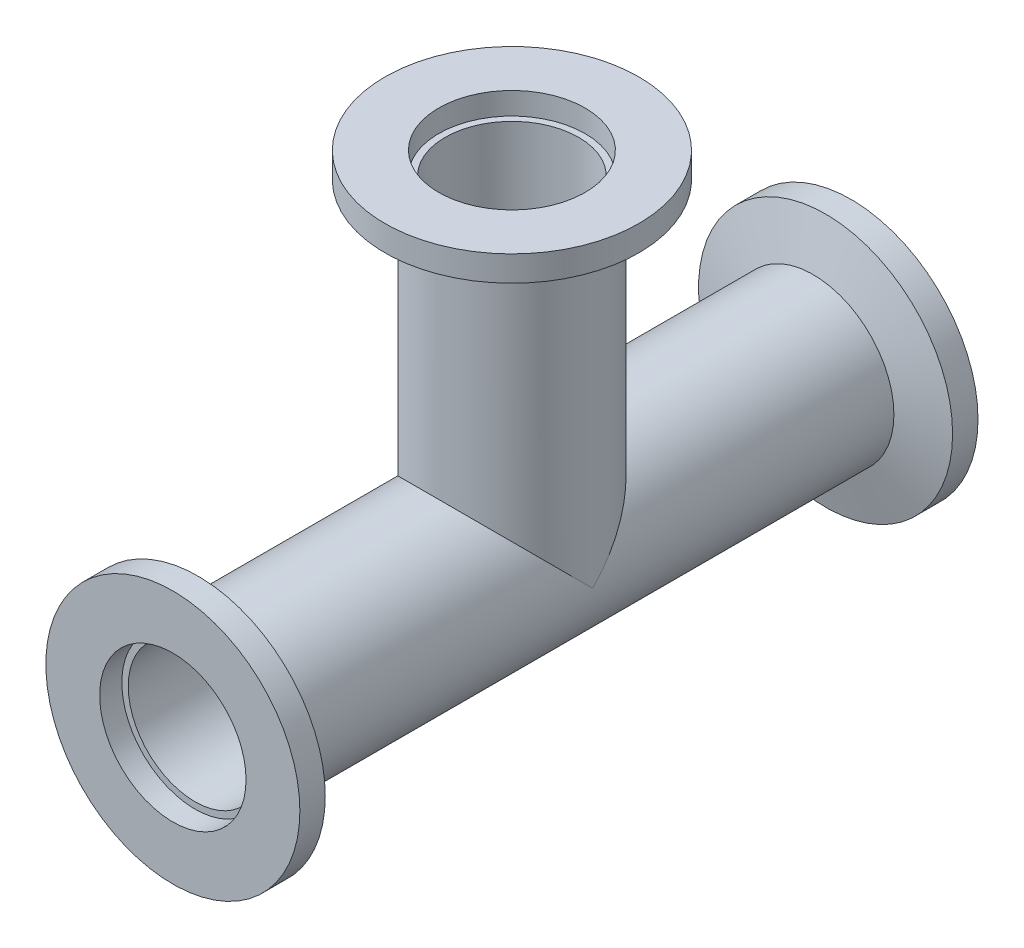
ISO-10303-21;
HEADER;
FILE_DESCRIPTION(('STEP AP214'),'2;1');
FILE_NAME('part.step','',(''),(''),'','','');
FILE_SCHEMA(('AUTOMOTIVE_DESIGN { 1 0 10303 214 1 1 1 1 }'));
ENDSEC;
DATA;
#1=APPLICATION_CONTEXT('core data for automotive mechanical design processes');
#2=APPLICATION_PROTOCOL_DEFINITION('international standard','automotive_design',2000,#1);
#3=PRODUCT_CONTEXT('',#1,'mechanical');
#4=PRODUCT('Part','Part','',(#3));
#5=PRODUCT_RELATED_PRODUCT_CATEGORY('part','',(#4));
#6=PRODUCT_DEFINITION_FORMATION('','',#4);
#7=PRODUCT_DEFINITION_CONTEXT('part definition',#1,'design');
#8=PRODUCT_DEFINITION('design','',#6,#7);
#9=PRODUCT_DEFINITION_SHAPE('','',#8);
#10=(LENGTH_UNIT() NAMED_UNIT(*) SI_UNIT(.MILLI.,.METRE.));
#11=(NAMED_UNIT(*) PLANE_ANGLE_UNIT() SI_UNIT($,.RADIAN.));
#12=(NAMED_UNIT(*) SI_UNIT($,.STERADIAN.) SOLID_ANGLE_UNIT());
#13=UNCERTAINTY_MEASURE_WITH_UNIT(LENGTH_MEASURE(1.E-05),#10,'distance_accuracy_value','');
#14=(GEOMETRIC_REPRESENTATION_CONTEXT(3) GLOBAL_UNCERTAINTY_ASSIGNED_CONTEXT((#13)) GLOBAL_UNIT_ASSIGNED_CONTEXT((#10,
#11,#12)) REPRESENTATION_CONTEXT('',''));
#15=CARTESIAN_POINT('',(0.,0.,0.));
#16=DIRECTION('',(0.,0.,1.));
#17=DIRECTION('',(1.,0.,0.));
#18=AXIS2_PLACEMENT_3D('',#15,#16,#17);
#19=CARTESIAN_POINT('',(0.,-12.5095,-40.005));
#20=DIRECTION('',(0.,0.,1.));
#21=DIRECTION('',(1.,0.,0.));
#22=AXIS2_PLACEMENT_3D('',#19,#20,#21);
#23=CYLINDRICAL_SURFACE('',#22,7.874);
#24=CARTESIAN_POINT('',(0.,-12.5095,-37.3888));
#25=DIRECTION('',(0.,0.,1.));
#26=DIRECTION('',(1.,0.,0.));
#27=AXIS2_PLACEMENT_3D('',#24,#25,#26);
#28=CIRCLE('',#27,7.874);
#29=CARTESIAN_POINT('',(7.874,-12.5095,-37.3888));
#30=VERTEX_POINT('',#29);
#31=EDGE_CURVE('E161',#30,#30,#28,.T.);
#32=ORIENTED_EDGE('',*,*,#31,.F.);
#33=EDGE_LOOP('',(#32));
#34=FACE_BOUND('',#33,.T.);
#35=CARTESIAN_POINT('',(0.,-12.5095,37.3888));
#36=DIRECTION('',(0.,0.,-1.));
#37=DIRECTION('',(-1.,0.,0.));
#38=AXIS2_PLACEMENT_3D('',#35,#36,#37);
#39=CIRCLE('',#38,7.874);
#40=CARTESIAN_POINT('',(-7.874,-12.5095,37.3888));
#41=VERTEX_POINT('',#40);
#42=EDGE_CURVE('E159',#41,#41,#39,.T.);
#43=ORIENTED_EDGE('',*,*,#42,.F.);
#44=EDGE_LOOP('',(#43));
#45=FACE_BOUND('',#44,.T.);
#46=CARTESIAN_POINT('',(0.,-12.5095,0.));
#47=DIRECTION('',(0.,-0.707106781186547,0.707106781186547));
#48=DIRECTION('',(0.,0.707106781186547,0.707106781186547));
#49=AXIS2_PLACEMENT_3D('',#46,#47,#48);
#50=ELLIPSE('',#49,11.1355175901257,7.874);
#51=CARTESIAN_POINT('',(7.874,-12.5095,0.));
#52=VERTEX_POINT('',#51);
#53=CARTESIAN_POINT('',(-7.874,-12.5095,0.));
#54=VERTEX_POINT('',#53);
#55=EDGE_CURVE('E11',#52,#54,#50,.T.);
#56=ORIENTED_EDGE('',*,*,#55,.F.);
#57=CARTESIAN_POINT('',(0.,-12.5095,0.));
#58=DIRECTION('',(0.,0.707106781186547,0.707106781186547));
#59=DIRECTION('',(0.,-0.707106781186547,0.707106781186547));
#60=AXIS2_PLACEMENT_3D('',#57,#58,#59);
#61=ELLIPSE('',#60,11.1355175901257,7.874);
#62=EDGE_CURVE('E47',#54,#52,#61,.F.);
#63=ORIENTED_EDGE('',*,*,#62,.F.);
#64=EDGE_LOOP('',(#56,#63));
#65=FACE_BOUND('',#64,.T.);
#66=ADVANCED_FACE('F39',(#34,#45,#65),#23,.F.);
#67=CARTESIAN_POINT('',(0.,-12.5095,40.005));
#68=DIRECTION('',(0.,0.,1.));
#69=DIRECTION('',(1.,0.,0.));
#70=AXIS2_PLACEMENT_3D('',#67,#68,#69);
#71=CYLINDRICAL_SURFACE('',#70,9.525);
#72=CARTESIAN_POINT('',(0.,-12.5095,-35.5445294601337));
#73=DIRECTION('',(0.,0.,1.));
#74=DIRECTION('',(1.,0.,0.));
#75=AXIS2_PLACEMENT_3D('',#72,#73,#74);
#76=CIRCLE('',#75,9.525);
#77=CARTESIAN_POINT('',(9.525,-12.5095,-35.5445294601337));
#78=VERTEX_POINT('',#77);
#79=EDGE_CURVE('E153',#78,#78,#76,.T.);
#80=ORIENTED_EDGE('',*,*,#79,.T.);
#81=EDGE_LOOP('',(#80));
#82=FACE_BOUND('',#81,.T.);
#83=CARTESIAN_POINT('',(0.,-12.5095,35.5445294601336));
#84=DIRECTION('',(0.,0.,1.));
#85=DIRECTION('',(1.,0.,0.));
#86=AXIS2_PLACEMENT_3D('',#83,#84,#85);
#87=CIRCLE('',#86,9.525);
#88=CARTESIAN_POINT('',(9.525,-12.5095,35.5445294601336));
#89=VERTEX_POINT('',#88);
#90=EDGE_CURVE('E149',#89,#89,#87,.T.);
#91=ORIENTED_EDGE('',*,*,#90,.F.);
#92=EDGE_LOOP('',(#91));
#93=FACE_BOUND('',#92,.T.);
#94=CARTESIAN_POINT('',(0.,-12.5095,0.));
#95=DIRECTION('',(0.,-0.707106781186547,0.707106781186547));
#96=DIRECTION('',(0.,0.707106781186547,0.707106781186547));
#97=AXIS2_PLACEMENT_3D('',#94,#95,#96);
#98=ELLIPSE('',#97,13.4703841816037,9.525);
#99=CARTESIAN_POINT('',(-9.525,-12.5095,0.));
#100=VERTEX_POINT('',#99);
#101=CARTESIAN_POINT('',(9.525,-12.5095,0.));
#102=VERTEX_POINT('',#101);
#103=EDGE_CURVE('E66',#100,#102,#98,.F.);
#104=ORIENTED_EDGE('',*,*,#103,.F.);
#105=CARTESIAN_POINT('',(0.,-12.5095,0.));
#106=DIRECTION('',(0.,0.707106781186547,0.707106781186547));
#107=DIRECTION('',(0.,-0.707106781186547,0.707106781186547));
#108=AXIS2_PLACEMENT_3D('',#105,#106,#107);
#109=ELLIPSE('',#108,13.4703841816037,9.525);
#110=EDGE_CURVE('E58',#102,#100,#109,.T.);
#111=ORIENTED_EDGE('',*,*,#110,.F.);
#112=EDGE_LOOP('',(#104,#111));
#113=FACE_BOUND('',#112,.T.);
#114=ADVANCED_FACE('F68',(#82,#93,#113),#71,.T.);
#115=CARTESIAN_POINT('',(0.,-3.87350000000002,40.005));
#116=DIRECTION('',(0.,0.,-1.));
#117=DIRECTION('',(-1.,0.,0.));
#118=AXIS2_PLACEMENT_3D('',#115,#116,#117);
#119=PLANE('',#118);
#120=CARTESIAN_POINT('',(0.,-12.5095,40.005));
#121=DIRECTION('',(0.,0.,1.));
#122=DIRECTION('',(1.,0.,0.));
#123=AXIS2_PLACEMENT_3D('',#120,#121,#122);
#124=CIRCLE('',#123,8.63599999999998);
#125=CARTESIAN_POINT('',(8.63599999999998,-12.5095,40.005));
#126=VERTEX_POINT('',#125);
#127=EDGE_CURVE('E185',#126,#126,#124,.T.);
#128=ORIENTED_EDGE('',*,*,#127,.F.);
#129=EDGE_LOOP('',(#128));
#130=FACE_BOUND('',#129,.T.);
#131=CARTESIAN_POINT('',(0.,-12.5095,40.005));
#132=DIRECTION('',(0.,0.,1.));
#133=DIRECTION('',(1.,0.,0.));
#134=AXIS2_PLACEMENT_3D('',#131,#132,#133);
#135=CIRCLE('',#134,14.986);
#136=CARTESIAN_POINT('',(14.986,-12.5095,40.005));
#137=VERTEX_POINT('',#136);
#138=EDGE_CURVE('E145',#137,#137,#135,.T.);
#139=ORIENTED_EDGE('',*,*,#138,.T.);
#140=EDGE_LOOP('',(#139));
#141=FACE_BOUND('',#140,.T.);
#142=ADVANCED_FACE('F41',(#130,#141),#119,.F.);
#143=CARTESIAN_POINT('',(0.,-12.5095,40.005));
#144=DIRECTION('',(0.,0.,1.));
#145=DIRECTION('',(1.,0.,0.));
#146=AXIS2_PLACEMENT_3D('',#143,#144,#145);
#147=CYLINDRICAL_SURFACE('',#146,14.986);
#148=ORIENTED_EDGE('',*,*,#138,.F.);
#149=EDGE_LOOP('',(#148));
#150=FACE_BOUND('',#149,.T.);
#151=CARTESIAN_POINT('',(0.,-12.5095,37.0078));
#152=DIRECTION('',(0.,0.,1.));
#153=DIRECTION('',(1.,0.,0.));
#154=AXIS2_PLACEMENT_3D('',#151,#152,#153);
#155=CIRCLE('',#154,14.986);
#156=CARTESIAN_POINT('',(14.986,-12.5095,37.0078));
#157=VERTEX_POINT('',#156);
#158=EDGE_CURVE('E148',#157,#157,#155,.T.);
#159=ORIENTED_EDGE('',*,*,#158,.T.);
#160=EDGE_LOOP('',(#159));
#161=FACE_BOUND('',#160,.T.);
#162=ADVANCED_FACE('F134',(#150,#161),#147,.T.);
#163=CARTESIAN_POINT('',(0.,-12.5095,35.5445294601336));
#164=DIRECTION('',(0.,0.,1.));
#165=DIRECTION('',(1.,0.,0.));
#166=AXIS2_PLACEMENT_3D('',#163,#164,#165);
#167=CONICAL_SURFACE('',#166,9.525,1.30899693899575);
#168=ORIENTED_EDGE('',*,*,#158,.F.);
#169=EDGE_LOOP('',(#168));
#170=FACE_BOUND('',#169,.T.);
#171=ORIENTED_EDGE('',*,*,#90,.T.);
#172=EDGE_LOOP('',(#171));
#173=FACE_BOUND('',#172,.T.);
#174=ADVANCED_FACE('F130',(#170,#173),#167,.T.);
#175=CARTESIAN_POINT('',(0.,-12.5095,-37.0078));
#176=DIRECTION('',(0.,0.,-1.));
#177=DIRECTION('',(-1.,0.,0.));
#178=AXIS2_PLACEMENT_3D('',#175,#176,#177);
#179=CONICAL_SURFACE('',#178,14.986,1.30899693899575);
#180=ORIENTED_EDGE('',*,*,#79,.F.);
#181=EDGE_LOOP('',(#180));
#182=FACE_BOUND('',#181,.T.);
#183=CARTESIAN_POINT('',(0.,-12.5095,-37.0078));
#184=DIRECTION('',(0.,0.,1.));
#185=DIRECTION('',(1.,0.,0.));
#186=AXIS2_PLACEMENT_3D('',#183,#184,#185);
#187=CIRCLE('',#186,14.986);
#188=CARTESIAN_POINT('',(14.986,-12.5095,-37.0078));
#189=VERTEX_POINT('',#188);
#190=EDGE_CURVE('E200',#189,#189,#187,.T.);
#191=ORIENTED_EDGE('',*,*,#190,.T.);
#192=EDGE_LOOP('',(#191));
#193=FACE_BOUND('',#192,.T.);
#194=ADVANCED_FACE('F127',(#182,#193),#179,.T.);
#195=CARTESIAN_POINT('',(0.,-12.5095,40.005));
#196=DIRECTION('',(0.,0.,1.));
#197=DIRECTION('',(1.,0.,0.));
#198=AXIS2_PLACEMENT_3D('',#195,#196,#197);
#199=CYLINDRICAL_SURFACE('',#198,14.986);
#200=ORIENTED_EDGE('',*,*,#190,.F.);
#201=EDGE_LOOP('',(#200));
#202=FACE_BOUND('',#201,.T.);
#203=CARTESIAN_POINT('',(0.,-12.5095,-40.005));
#204=DIRECTION('',(0.,0.,1.));
#205=DIRECTION('',(1.,0.,0.));
#206=AXIS2_PLACEMENT_3D('',#203,#204,#205);
#207=CIRCLE('',#206,14.986);
#208=CARTESIAN_POINT('',(14.986,-12.5095,-40.005));
#209=VERTEX_POINT('',#208);
#210=EDGE_CURVE('E197',#209,#209,#207,.T.);
#211=ORIENTED_EDGE('',*,*,#210,.T.);
#212=EDGE_LOOP('',(#211));
#213=FACE_BOUND('',#212,.T.);
#214=ADVANCED_FACE('F123',(#202,#213),#199,.T.);
#215=CARTESIAN_POINT('',(0.,2.4765,-40.005));
#216=DIRECTION('',(0.,0.,1.));
#217=DIRECTION('',(1.,0.,0.));
#218=AXIS2_PLACEMENT_3D('',#215,#216,#217);
#219=PLANE('',#218);
#220=ORIENTED_EDGE('',*,*,#210,.F.);
#221=EDGE_LOOP('',(#220));
#222=FACE_BOUND('',#221,.T.);
#223=CARTESIAN_POINT('',(0.,-12.5095,-40.005));
#224=DIRECTION('',(0.,0.,1.));
#225=DIRECTION('',(1.,0.,0.));
#226=AXIS2_PLACEMENT_3D('',#223,#224,#225);
#227=CIRCLE('',#226,8.636);
#228=CARTESIAN_POINT('',(8.636,-12.5095,-40.005));
#229=VERTEX_POINT('',#228);
#230=EDGE_CURVE('E194',#229,#229,#227,.T.);
#231=ORIENTED_EDGE('',*,*,#230,.T.);
#232=EDGE_LOOP('',(#231));
#233=FACE_BOUND('',#232,.T.);
#234=ADVANCED_FACE('F119',(#222,#233),#219,.F.);
#235=CARTESIAN_POINT('',(0.,-12.5095,40.005));
#236=DIRECTION('',(0.,0.,1.));
#237=DIRECTION('',(1.,0.,0.));
#238=AXIS2_PLACEMENT_3D('',#235,#236,#237);
#239=CYLINDRICAL_SURFACE('',#238,8.636);
#240=ORIENTED_EDGE('',*,*,#230,.F.);
#241=EDGE_LOOP('',(#240));
#242=FACE_BOUND('',#241,.T.);
#243=CARTESIAN_POINT('',(0.,-12.5095,-37.3888));
#244=DIRECTION('',(0.,0.,1.));
#245=DIRECTION('',(1.,0.,0.));
#246=AXIS2_PLACEMENT_3D('',#243,#244,#245);
#247=CIRCLE('',#246,8.636);
#248=CARTESIAN_POINT('',(8.636,-12.5095,-37.3888));
#249=VERTEX_POINT('',#248);
#250=EDGE_CURVE('E191',#249,#249,#247,.T.);
#251=ORIENTED_EDGE('',*,*,#250,.T.);
#252=EDGE_LOOP('',(#251));
#253=FACE_BOUND('',#252,.T.);
#254=ADVANCED_FACE('F115',(#242,#253),#239,.F.);
#255=CARTESIAN_POINT('',(0.,-3.8735,-37.3888));
#256=DIRECTION('',(0.,0.,1.));
#257=DIRECTION('',(1.,0.,0.));
#258=AXIS2_PLACEMENT_3D('',#255,#256,#257);
#259=PLANE('',#258);
#260=ORIENTED_EDGE('',*,*,#31,.T.);
#261=EDGE_LOOP('',(#260));
#262=FACE_BOUND('',#261,.T.);
#263=ORIENTED_EDGE('',*,*,#250,.F.);
#264=EDGE_LOOP('',(#263));
#265=FACE_BOUND('',#264,.T.);
#266=ADVANCED_FACE('F111',(#262,#265),#259,.F.);
#267=CARTESIAN_POINT('',(0.,-3.87350000000002,37.3888));
#268=DIRECTION('',(0.,0.,-1.));
#269=DIRECTION('',(-1.,0.,0.));
#270=AXIS2_PLACEMENT_3D('',#267,#268,#269);
#271=PLANE('',#270);
#272=ORIENTED_EDGE('',*,*,#42,.T.);
#273=EDGE_LOOP('',(#272));
#274=FACE_BOUND('',#273,.T.);
#275=CARTESIAN_POINT('',(0.,-12.5095,37.3888));
#276=DIRECTION('',(0.,0.,1.));
#277=DIRECTION('',(1.,0.,0.));
#278=AXIS2_PLACEMENT_3D('',#275,#276,#277);
#279=CIRCLE('',#278,8.63599999999998);
#280=CARTESIAN_POINT('',(8.63599999999998,-12.5095,37.3888));
#281=VERTEX_POINT('',#280);
#282=EDGE_CURVE('E188',#281,#281,#279,.T.);
#283=ORIENTED_EDGE('',*,*,#282,.T.);
#284=EDGE_LOOP('',(#283));
#285=FACE_BOUND('',#284,.T.);
#286=ADVANCED_FACE('F108',(#274,#285),#271,.F.);
#287=CARTESIAN_POINT('',(0.,-12.5095,40.005));
#288=DIRECTION('',(0.,0.,1.));
#289=DIRECTION('',(1.,0.,0.));
#290=AXIS2_PLACEMENT_3D('',#287,#288,#289);
#291=CYLINDRICAL_SURFACE('',#290,8.63599999999998);
#292=ORIENTED_EDGE('',*,*,#282,.F.);
#293=EDGE_LOOP('',(#292));
#294=FACE_BOUND('',#293,.T.);
#295=ORIENTED_EDGE('',*,*,#127,.T.);
#296=EDGE_LOOP('',(#295));
#297=FACE_BOUND('',#296,.T.);
#298=ADVANCED_FACE('F95',(#294,#297),#291,.F.);
#299=CARTESIAN_POINT('',(0.,-12.5095,0.));
#300=DIRECTION('',(0.,-1.,0.));
#301=DIRECTION('',(0.,0.,-1.));
#302=AXIS2_PLACEMENT_3D('',#299,#300,#301);
#303=CYLINDRICAL_SURFACE('',#302,9.525);
#304=CARTESIAN_POINT('',(0.,23.0350294601337,0.));
#305=DIRECTION('',(0.,-1.,0.));
#306=DIRECTION('',(0.,0.,-1.));
#307=AXIS2_PLACEMENT_3D('',#304,#305,#306);
#308=CIRCLE('',#307,9.52500000000001);
#309=CARTESIAN_POINT('',(0.,23.0350294601337,-9.52500000000001));
#310=VERTEX_POINT('',#309);
#311=EDGE_CURVE('E176',#310,#310,#308,.T.);
#312=ORIENTED_EDGE('',*,*,#311,.T.);
#313=EDGE_LOOP('',(#312));
#314=FACE_BOUND('',#313,.T.);
#315=ORIENTED_EDGE('',*,*,#110,.T.);
#316=ORIENTED_EDGE('',*,*,#103,.T.);
#317=EDGE_LOOP('',(#315,#316));
#318=FACE_BOUND('',#317,.T.);
#319=ADVANCED_FACE('F91',(#314,#318),#303,.T.);
#320=CARTESIAN_POINT('',(0.,27.4955,14.986));
#321=DIRECTION('',(0.,-1.,0.));
#322=DIRECTION('',(0.,0.,-1.));
#323=AXIS2_PLACEMENT_3D('',#320,#321,#322);
#324=PLANE('',#323);
#325=CARTESIAN_POINT('',(0.,27.4955,0.));
#326=DIRECTION('',(0.,-1.,0.));
#327=DIRECTION('',(0.,0.,-1.));
#328=AXIS2_PLACEMENT_3D('',#325,#326,#327);
#329=CIRCLE('',#328,14.986);
#330=CARTESIAN_POINT('',(0.,27.4955,-14.986));
#331=VERTEX_POINT('',#330);
#332=EDGE_CURVE('E165',#331,#331,#329,.T.);
#333=ORIENTED_EDGE('',*,*,#332,.F.);
#334=EDGE_LOOP('',(#333));
#335=FACE_BOUND('',#334,.T.);
#336=CARTESIAN_POINT('',(0.,27.4955,0.));
#337=DIRECTION('',(0.,-1.,0.));
#338=DIRECTION('',(0.,0.,-1.));
#339=AXIS2_PLACEMENT_3D('',#336,#337,#338);
#340=CIRCLE('',#339,8.63600000000002);
#341=CARTESIAN_POINT('',(0.,27.4955,-8.63600000000002));
#342=VERTEX_POINT('',#341);
#343=EDGE_CURVE('E182',#342,#342,#340,.T.);
#344=ORIENTED_EDGE('',*,*,#343,.T.);
#345=EDGE_LOOP('',(#344));
#346=FACE_BOUND('',#345,.T.);
#347=ADVANCED_FACE('F94',(#335,#346),#324,.F.);
#348=CARTESIAN_POINT('',(0.,-12.5095,0.));
#349=DIRECTION('',(0.,-1.,0.));
#350=DIRECTION('',(0.,0.,-1.));
#351=AXIS2_PLACEMENT_3D('',#348,#349,#350);
#352=CYLINDRICAL_SURFACE('',#351,8.63600000000002);
#353=ORIENTED_EDGE('',*,*,#343,.F.);
#354=EDGE_LOOP('',(#353));
#355=FACE_BOUND('',#354,.T.);
#356=CARTESIAN_POINT('',(0.,24.8793,0.));
#357=DIRECTION('',(0.,-1.,0.));
#358=DIRECTION('',(0.,0.,-1.));
#359=AXIS2_PLACEMENT_3D('',#356,#357,#358);
#360=CIRCLE('',#359,8.63600000000002);
#361=CARTESIAN_POINT('',(0.,24.8793,-8.63600000000002));
#362=VERTEX_POINT('',#361);
#363=EDGE_CURVE('E179',#362,#362,#360,.T.);
#364=ORIENTED_EDGE('',*,*,#363,.T.);
#365=EDGE_LOOP('',(#364));
#366=FACE_BOUND('',#365,.T.);
#367=ADVANCED_FACE('F98',(#355,#366),#352,.F.);
#368=CARTESIAN_POINT('',(0.,24.8793,8.63600000000002));
#369=DIRECTION('',(0.,-1.,0.));
#370=DIRECTION('',(0.,0.,-1.));
#371=AXIS2_PLACEMENT_3D('',#368,#369,#370);
#372=PLANE('',#371);
#373=CARTESIAN_POINT('',(0.,24.8793,0.));
#374=DIRECTION('',(0.,-1.,0.));
#375=DIRECTION('',(0.,0.,-1.));
#376=AXIS2_PLACEMENT_3D('',#373,#374,#375);
#377=CIRCLE('',#376,7.874);
#378=CARTESIAN_POINT('',(0.,24.8793,-7.87400000000002));
#379=VERTEX_POINT('',#378);
#380=EDGE_CURVE('E162',#379,#379,#377,.F.);
#381=ORIENTED_EDGE('',*,*,#380,.F.);
#382=EDGE_LOOP('',(#381));
#383=FACE_BOUND('',#382,.T.);
#384=ORIENTED_EDGE('',*,*,#363,.F.);
#385=EDGE_LOOP('',(#384));
#386=FACE_BOUND('',#385,.T.);
#387=ADVANCED_FACE('F89',(#383,#386),#372,.F.);
#388=CARTESIAN_POINT('',(0.,24.4983,0.));
#389=DIRECTION('',(0.,1.,0.));
#390=DIRECTION('',(0.,0.,1.));
#391=AXIS2_PLACEMENT_3D('',#388,#389,#390);
#392=CONICAL_SURFACE('',#391,14.986,1.30899693899575);
#393=ORIENTED_EDGE('',*,*,#311,.F.);
#394=EDGE_LOOP('',(#393));
#395=FACE_BOUND('',#394,.T.);
#396=CARTESIAN_POINT('',(0.,24.4983,0.));
#397=DIRECTION('',(0.,-1.,0.));
#398=DIRECTION('',(0.,0.,-1.));
#399=AXIS2_PLACEMENT_3D('',#396,#397,#398);
#400=CIRCLE('',#399,14.986);
#401=CARTESIAN_POINT('',(0.,24.4983,-14.986));
#402=VERTEX_POINT('',#401);
#403=EDGE_CURVE('E173',#402,#402,#400,.T.);
#404=ORIENTED_EDGE('',*,*,#403,.T.);
#405=EDGE_LOOP('',(#404));
#406=FACE_BOUND('',#405,.T.);
#407=ADVANCED_FACE('F85',(#395,#406),#392,.T.);
#408=CARTESIAN_POINT('',(0.,-12.5095,0.));
#409=DIRECTION('',(0.,-1.,0.));
#410=DIRECTION('',(0.,0.,-1.));
#411=AXIS2_PLACEMENT_3D('',#408,#409,#410);
#412=CYLINDRICAL_SURFACE('',#411,14.986);
#413=ORIENTED_EDGE('',*,*,#403,.F.);
#414=EDGE_LOOP('',(#413));
#415=FACE_BOUND('',#414,.T.);
#416=ORIENTED_EDGE('',*,*,#332,.T.);
#417=EDGE_LOOP('',(#416));
#418=FACE_BOUND('',#417,.T.);
#419=ADVANCED_FACE('F82',(#415,#418),#412,.T.);
#420=CARTESIAN_POINT('',(0.,27.4955,0.));
#421=DIRECTION('',(0.,-1.,0.));
#422=DIRECTION('',(0.,0.,-1.));
#423=AXIS2_PLACEMENT_3D('',#420,#421,#422);
#424=CYLINDRICAL_SURFACE('',#423,7.874);
#425=ORIENTED_EDGE('',*,*,#55,.T.);
#426=ORIENTED_EDGE('',*,*,#62,.T.);
#427=EDGE_LOOP('',(#425,#426));
#428=FACE_BOUND('',#427,.T.);
#429=ORIENTED_EDGE('',*,*,#380,.T.);
#430=EDGE_LOOP('',(#429));
#431=FACE_BOUND('',#430,.T.);
#432=ADVANCED_FACE('F63',(#428,#431),#424,.F.);
#433=CLOSED_SHELL('',(#66,#114,#142,#162,#174,#194,#214,#234,#254,#266,#286,#298,#319,#347,#367,
#387,#407,#419,#432));
#434=MANIFOLD_SOLID_BREP('B2',#433);
#435=ADVANCED_BREP_SHAPE_REPRESENTATION('',(#18,#434),#14);
#436=SHAPE_DEFINITION_REPRESENTATION(#9,#435);
ENDSEC;
END-ISO-10303-21;
